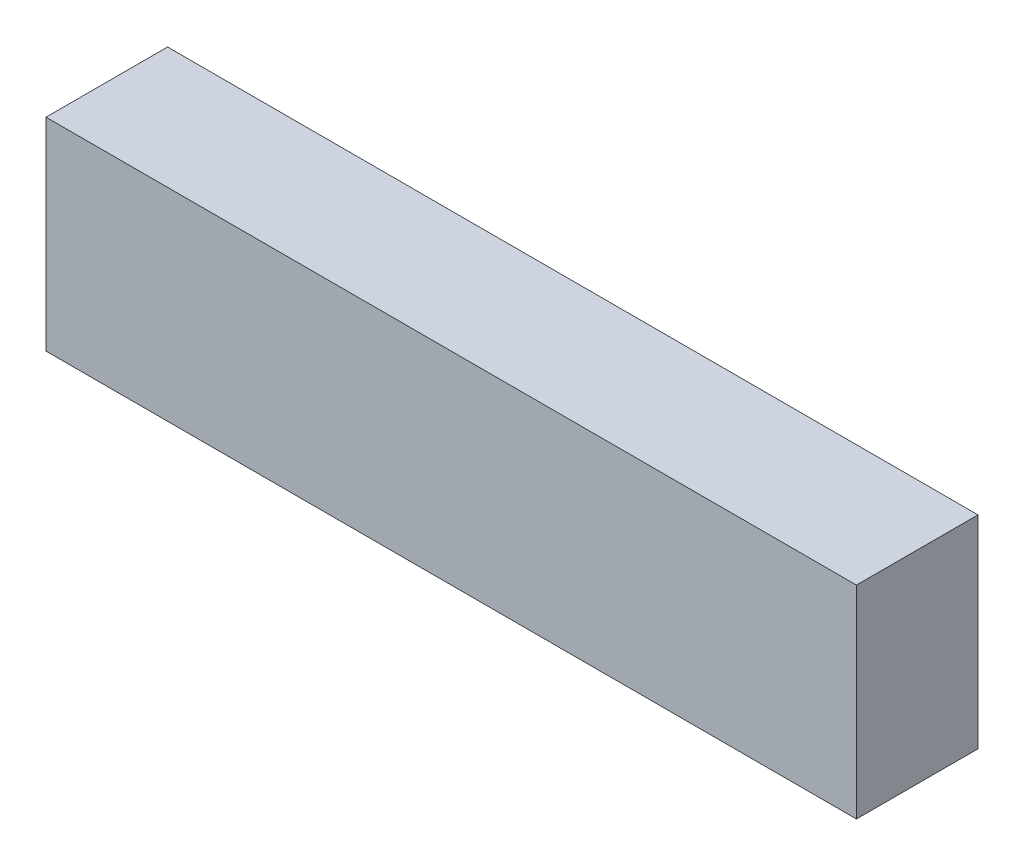
ISO-10303-21;
HEADER;
FILE_DESCRIPTION(('STEP AP214'),'2;1');
FILE_NAME('part.step','',(''),(''),'','','');
FILE_SCHEMA(('AUTOMOTIVE_DESIGN { 1 0 10303 214 1 1 1 1 }'));
ENDSEC;
DATA;
#1=APPLICATION_CONTEXT('core data for automotive mechanical design processes');
#2=APPLICATION_PROTOCOL_DEFINITION('international standard','automotive_design',2000,#1);
#3=PRODUCT_CONTEXT('',#1,'mechanical');
#4=PRODUCT('Part','Part','',(#3));
#5=PRODUCT_RELATED_PRODUCT_CATEGORY('part','',(#4));
#6=PRODUCT_DEFINITION_FORMATION('','',#4);
#7=PRODUCT_DEFINITION_CONTEXT('part definition',#1,'design');
#8=PRODUCT_DEFINITION('design','',#6,#7);
#9=PRODUCT_DEFINITION_SHAPE('','',#8);
#10=(LENGTH_UNIT() NAMED_UNIT(*) SI_UNIT(.MILLI.,.METRE.));
#11=(NAMED_UNIT(*) PLANE_ANGLE_UNIT() SI_UNIT($,.RADIAN.));
#12=(NAMED_UNIT(*) SI_UNIT($,.STERADIAN.) SOLID_ANGLE_UNIT());
#13=UNCERTAINTY_MEASURE_WITH_UNIT(LENGTH_MEASURE(1.E-05),#10,'distance_accuracy_value','');
#14=(GEOMETRIC_REPRESENTATION_CONTEXT(3) GLOBAL_UNCERTAINTY_ASSIGNED_CONTEXT((#13)) GLOBAL_UNIT_ASSIGNED_CONTEXT((#10,
#11,#12)) REPRESENTATION_CONTEXT('',''));
#15=CARTESIAN_POINT('',(0.,0.,0.));
#16=DIRECTION('',(0.,0.,1.));
#17=DIRECTION('',(1.,0.,0.));
#18=AXIS2_PLACEMENT_3D('',#15,#16,#17);
#19=CARTESIAN_POINT('',(100.,-25.,30.));
#20=DIRECTION('',(-1.,0.,0.));
#21=DIRECTION('',(0.,0.,1.));
#22=AXIS2_PLACEMENT_3D('',#19,#20,#21);
#23=PLANE('',#22);
#24=DIRECTION('',(0.,1.,0.));
#25=VECTOR('',#24,1.);
#26=CARTESIAN_POINT('',(100.,-25.,0.));
#27=LINE('',#26,#25);
#28=CARTESIAN_POINT('',(100.,-25.,0.));
#29=VERTEX_POINT('',#28);
#30=CARTESIAN_POINT('',(100.,25.,0.));
#31=VERTEX_POINT('',#30);
#32=EDGE_CURVE('E100',#29,#31,#27,.T.);
#33=ORIENTED_EDGE('',*,*,#32,.T.);
#34=DIRECTION('',(0.,0.,-1.));
#35=VECTOR('',#34,1.);
#36=CARTESIAN_POINT('',(100.,25.,30.));
#37=LINE('',#36,#35);
#38=CARTESIAN_POINT('',(100.,25.,30.));
#39=VERTEX_POINT('',#38);
#40=EDGE_CURVE('E11',#39,#31,#37,.T.);
#41=ORIENTED_EDGE('',*,*,#40,.F.);
#42=DIRECTION('',(0.,1.,0.));
#43=VECTOR('',#42,1.);
#44=CARTESIAN_POINT('',(100.,-25.,30.));
#45=LINE('',#44,#43);
#46=CARTESIAN_POINT('',(100.,-25.,30.));
#47=VERTEX_POINT('',#46);
#48=EDGE_CURVE('E88',#47,#39,#45,.T.);
#49=ORIENTED_EDGE('',*,*,#48,.F.);
#50=DIRECTION('',(0.,0.,-1.));
#51=VECTOR('',#50,1.);
#52=CARTESIAN_POINT('',(100.,-25.,30.));
#53=LINE('',#52,#51);
#54=EDGE_CURVE('E96',#47,#29,#53,.T.);
#55=ORIENTED_EDGE('',*,*,#54,.T.);
#56=EDGE_LOOP('',(#33,#41,#49,#55));
#57=FACE_BOUND('',#56,.T.);
#58=ADVANCED_FACE('F37',(#57),#23,.F.);
#59=CARTESIAN_POINT('',(-100.,25.,30.));
#60=DIRECTION('',(0.,-1.,0.));
#61=DIRECTION('',(0.,0.,-1.));
#62=AXIS2_PLACEMENT_3D('',#59,#60,#61);
#63=PLANE('',#62);
#64=DIRECTION('',(-1.,0.,0.));
#65=VECTOR('',#64,1.);
#66=CARTESIAN_POINT('',(-100.,25.,0.));
#67=LINE('',#66,#65);
#68=CARTESIAN_POINT('',(-100.,25.,0.));
#69=VERTEX_POINT('',#68);
#70=EDGE_CURVE('E92',#31,#69,#67,.T.);
#71=ORIENTED_EDGE('',*,*,#70,.T.);
#72=DIRECTION('',(0.,0.,-1.));
#73=VECTOR('',#72,1.);
#74=CARTESIAN_POINT('',(-100.,25.,30.));
#75=LINE('',#74,#73);
#76=CARTESIAN_POINT('',(-100.,25.,30.));
#77=VERTEX_POINT('',#76);
#78=EDGE_CURVE('E45',#77,#69,#75,.T.);
#79=ORIENTED_EDGE('',*,*,#78,.F.);
#80=DIRECTION('',(-1.,0.,0.));
#81=VECTOR('',#80,1.);
#82=CARTESIAN_POINT('',(-100.,25.,30.));
#83=LINE('',#82,#81);
#84=EDGE_CURVE('E83',#39,#77,#83,.T.);
#85=ORIENTED_EDGE('',*,*,#84,.F.);
#86=ORIENTED_EDGE('',*,*,#40,.T.);
#87=EDGE_LOOP('',(#71,#79,#85,#86));
#88=FACE_BOUND('',#87,.T.);
#89=ADVANCED_FACE('F91',(#88),#63,.F.);
#90=CARTESIAN_POINT('',(-100.,-25.,30.));
#91=DIRECTION('',(1.,0.,0.));
#92=DIRECTION('',(0.,0.,-1.));
#93=AXIS2_PLACEMENT_3D('',#90,#91,#92);
#94=PLANE('',#93);
#95=DIRECTION('',(0.,-1.,0.));
#96=VECTOR('',#95,1.);
#97=CARTESIAN_POINT('',(-100.,-25.,0.));
#98=LINE('',#97,#96);
#99=CARTESIAN_POINT('',(-100.,-25.,0.));
#100=VERTEX_POINT('',#99);
#101=EDGE_CURVE('E70',#69,#100,#98,.T.);
#102=ORIENTED_EDGE('',*,*,#101,.T.);
#103=DIRECTION('',(0.,0.,-1.));
#104=VECTOR('',#103,1.);
#105=CARTESIAN_POINT('',(-100.,-25.,30.));
#106=LINE('',#105,#104);
#107=CARTESIAN_POINT('',(-100.,-25.,30.));
#108=VERTEX_POINT('',#107);
#109=EDGE_CURVE('E93',#108,#100,#106,.T.);
#110=ORIENTED_EDGE('',*,*,#109,.F.);
#111=DIRECTION('',(0.,-1.,0.));
#112=VECTOR('',#111,1.);
#113=CARTESIAN_POINT('',(-100.,-25.,30.));
#114=LINE('',#113,#112);
#115=EDGE_CURVE('E86',#77,#108,#114,.T.);
#116=ORIENTED_EDGE('',*,*,#115,.F.);
#117=ORIENTED_EDGE('',*,*,#78,.T.);
#118=EDGE_LOOP('',(#102,#110,#116,#117));
#119=FACE_BOUND('',#118,.T.);
#120=ADVANCED_FACE('F94',(#119),#94,.F.);
#121=CARTESIAN_POINT('',(-100.,-25.,30.));
#122=DIRECTION('',(0.,1.,0.));
#123=DIRECTION('',(0.,0.,1.));
#124=AXIS2_PLACEMENT_3D('',#121,#122,#123);
#125=PLANE('',#124);
#126=DIRECTION('',(1.,0.,0.));
#127=VECTOR('',#126,1.);
#128=CARTESIAN_POINT('',(-100.,-25.,0.));
#129=LINE('',#128,#127);
#130=EDGE_CURVE('E76',#100,#29,#129,.T.);
#131=ORIENTED_EDGE('',*,*,#130,.T.);
#132=ORIENTED_EDGE('',*,*,#54,.F.);
#133=DIRECTION('',(1.,0.,0.));
#134=VECTOR('',#133,1.);
#135=CARTESIAN_POINT('',(-100.,-25.,30.));
#136=LINE('',#135,#134);
#137=EDGE_CURVE('E53',#108,#47,#136,.T.);
#138=ORIENTED_EDGE('',*,*,#137,.F.);
#139=ORIENTED_EDGE('',*,*,#109,.T.);
#140=EDGE_LOOP('',(#131,#132,#138,#139));
#141=FACE_BOUND('',#140,.T.);
#142=ADVANCED_FACE('F107',(#141),#125,.F.);
#143=CARTESIAN_POINT('',(0.,0.,30.));
#144=DIRECTION('',(0.,0.,-1.));
#145=DIRECTION('',(-1.,0.,0.));
#146=AXIS2_PLACEMENT_3D('',#143,#144,#145);
#147=PLANE('',#146);
#148=ORIENTED_EDGE('',*,*,#48,.T.);
#149=ORIENTED_EDGE('',*,*,#84,.T.);
#150=ORIENTED_EDGE('',*,*,#115,.T.);
#151=ORIENTED_EDGE('',*,*,#137,.T.);
#152=EDGE_LOOP('',(#148,#149,#150,#151));
#153=FACE_BOUND('',#152,.T.);
#154=ADVANCED_FACE('F84',(#153),#147,.F.);
#155=CARTESIAN_POINT('',(0.,0.,0.));
#156=DIRECTION('',(0.,0.,-1.));
#157=DIRECTION('',(-1.,0.,0.));
#158=AXIS2_PLACEMENT_3D('',#155,#156,#157);
#159=PLANE('',#158);
#160=ORIENTED_EDGE('',*,*,#32,.F.);
#161=ORIENTED_EDGE('',*,*,#130,.F.);
#162=ORIENTED_EDGE('',*,*,#101,.F.);
#163=ORIENTED_EDGE('',*,*,#70,.F.);
#164=EDGE_LOOP('',(#160,#161,#162,#163));
#165=FACE_BOUND('',#164,.T.);
#166=ADVANCED_FACE('F110',(#165),#159,.T.);
#167=CLOSED_SHELL('',(#58,#89,#120,#142,#154,#166));
#168=MANIFOLD_SOLID_BREP('B2',#167);
#169=ADVANCED_BREP_SHAPE_REPRESENTATION('',(#18,#168),#14);
#170=SHAPE_DEFINITION_REPRESENTATION(#9,#169);
ENDSEC;
END-ISO-10303-21;
